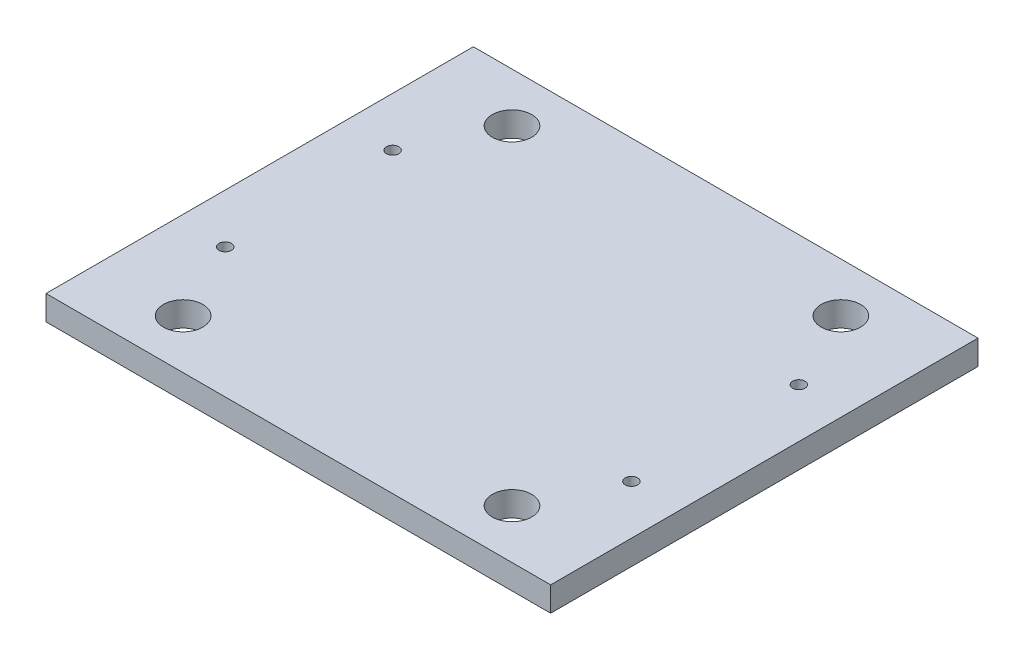
ISO-10303-21;
HEADER;
FILE_DESCRIPTION(('STEP AP214'),'2;1');
FILE_NAME('part.step','',(''),(''),'','','');
FILE_SCHEMA(('AUTOMOTIVE_DESIGN { 1 0 10303 214 1 1 1 1 }'));
ENDSEC;
DATA;
#1=APPLICATION_CONTEXT('core data for automotive mechanical design processes');
#2=APPLICATION_PROTOCOL_DEFINITION('international standard','automotive_design',2000,#1);
#3=PRODUCT_CONTEXT('',#1,'mechanical');
#4=PRODUCT('Part','Part','',(#3));
#5=PRODUCT_RELATED_PRODUCT_CATEGORY('part','',(#4));
#6=PRODUCT_DEFINITION_FORMATION('','',#4);
#7=PRODUCT_DEFINITION_CONTEXT('part definition',#1,'design');
#8=PRODUCT_DEFINITION('design','',#6,#7);
#9=PRODUCT_DEFINITION_SHAPE('','',#8);
#10=(LENGTH_UNIT() NAMED_UNIT(*) SI_UNIT(.MILLI.,.METRE.));
#11=(NAMED_UNIT(*) PLANE_ANGLE_UNIT() SI_UNIT($,.RADIAN.));
#12=(NAMED_UNIT(*) SI_UNIT($,.STERADIAN.) SOLID_ANGLE_UNIT());
#13=UNCERTAINTY_MEASURE_WITH_UNIT(LENGTH_MEASURE(1.E-05),#10,'distance_accuracy_value','');
#14=(GEOMETRIC_REPRESENTATION_CONTEXT(3) GLOBAL_UNCERTAINTY_ASSIGNED_CONTEXT((#13)) GLOBAL_UNIT_ASSIGNED_CONTEXT((#10,
#11,#12)) REPRESENTATION_CONTEXT('',''));
#15=CARTESIAN_POINT('',(0.,0.,0.));
#16=DIRECTION('',(0.,0.,1.));
#17=DIRECTION('',(1.,0.,0.));
#18=AXIS2_PLACEMENT_3D('',#15,#16,#17);
#19=CARTESIAN_POINT('',(0.,6.35,0.));
#20=DIRECTION('',(0.,-1.,0.));
#21=DIRECTION('',(0.,0.,-1.));
#22=AXIS2_PLACEMENT_3D('',#19,#20,#21);
#23=PLANE('',#22);
#24=DIRECTION('',(0.,0.,-1.));
#25=VECTOR('',#24,1.);
#26=CARTESIAN_POINT('',(65.0875,6.35,55.118));
#27=LINE('',#26,#25);
#28=CARTESIAN_POINT('',(65.0875,6.35,55.118));
#29=VERTEX_POINT('',#28);
#30=CARTESIAN_POINT('',(65.0875,6.35,-55.118));
#31=VERTEX_POINT('',#30);
#32=EDGE_CURVE('E89',#29,#31,#27,.T.);
#33=ORIENTED_EDGE('',*,*,#32,.T.);
#34=DIRECTION('',(-1.,0.,0.));
#35=VECTOR('',#34,1.);
#36=CARTESIAN_POINT('',(-65.0875,6.35,-55.118));
#37=LINE('',#36,#35);
#38=CARTESIAN_POINT('',(-65.0875,6.35,-55.118));
#39=VERTEX_POINT('',#38);
#40=EDGE_CURVE('E84',#31,#39,#37,.T.);
#41=ORIENTED_EDGE('',*,*,#40,.T.);
#42=DIRECTION('',(0.,0.,1.));
#43=VECTOR('',#42,1.);
#44=CARTESIAN_POINT('',(-65.0875,6.35,55.118));
#45=LINE('',#44,#43);
#46=CARTESIAN_POINT('',(-65.0875,6.35,55.118));
#47=VERTEX_POINT('',#46);
#48=EDGE_CURVE('E87',#39,#47,#45,.T.);
#49=ORIENTED_EDGE('',*,*,#48,.T.);
#50=DIRECTION('',(1.,0.,0.));
#51=VECTOR('',#50,1.);
#52=CARTESIAN_POINT('',(-65.0875,6.35,55.118));
#53=LINE('',#52,#51);
#54=EDGE_CURVE('E54',#47,#29,#53,.T.);
#55=ORIENTED_EDGE('',*,*,#54,.T.);
#56=EDGE_LOOP('',(#33,#41,#49,#55));
#57=FACE_BOUND('',#56,.T.);
#58=CARTESIAN_POINT('',(-52.3875,6.35,-21.59));
#59=DIRECTION('',(0.,1.,0.));
#60=DIRECTION('',(0.,0.,1.));
#61=AXIS2_PLACEMENT_3D('',#58,#59,#60);
#62=CIRCLE('',#61,1.5875);
#63=CARTESIAN_POINT('',(-52.3875,6.35,-20.0025));
#64=VERTEX_POINT('',#63);
#65=EDGE_CURVE('E104',#64,#64,#62,.T.);
#66=ORIENTED_EDGE('',*,*,#65,.F.);
#67=EDGE_LOOP('',(#66));
#68=FACE_BOUND('',#67,.T.);
#69=CARTESIAN_POINT('',(52.3875,6.35,-21.59));
#70=DIRECTION('',(0.,1.,0.));
#71=DIRECTION('',(0.,0.,1.));
#72=AXIS2_PLACEMENT_3D('',#69,#70,#71);
#73=CIRCLE('',#72,1.5875);
#74=CARTESIAN_POINT('',(52.3875,6.35,-20.0025));
#75=VERTEX_POINT('',#74);
#76=EDGE_CURVE('E119',#75,#75,#73,.T.);
#77=ORIENTED_EDGE('',*,*,#76,.F.);
#78=EDGE_LOOP('',(#77));
#79=FACE_BOUND('',#78,.T.);
#80=CARTESIAN_POINT('',(52.3875,6.35,21.59));
#81=DIRECTION('',(0.,1.,0.));
#82=DIRECTION('',(0.,0.,1.));
#83=AXIS2_PLACEMENT_3D('',#80,#81,#82);
#84=CIRCLE('',#83,1.5875);
#85=CARTESIAN_POINT('',(52.3875,6.35,23.1775));
#86=VERTEX_POINT('',#85);
#87=EDGE_CURVE('E125',#86,#86,#84,.T.);
#88=ORIENTED_EDGE('',*,*,#87,.F.);
#89=EDGE_LOOP('',(#88));
#90=FACE_BOUND('',#89,.T.);
#91=CARTESIAN_POINT('',(-52.3875,6.35,21.59));
#92=DIRECTION('',(0.,1.,0.));
#93=DIRECTION('',(0.,0.,1.));
#94=AXIS2_PLACEMENT_3D('',#91,#92,#93);
#95=CIRCLE('',#94,1.5875);
#96=CARTESIAN_POINT('',(-52.3875,6.35,23.1775));
#97=VERTEX_POINT('',#96);
#98=EDGE_CURVE('E131',#97,#97,#95,.T.);
#99=ORIENTED_EDGE('',*,*,#98,.F.);
#100=EDGE_LOOP('',(#99));
#101=FACE_BOUND('',#100,.T.);
#102=CARTESIAN_POINT('',(-42.418,6.35,-42.418));
#103=DIRECTION('',(0.,1.,0.));
#104=DIRECTION('',(0.,0.,1.));
#105=AXIS2_PLACEMENT_3D('',#102,#103,#104);
#106=CIRCLE('',#105,5.08000000000001);
#107=CARTESIAN_POINT('',(-42.418,6.35,-37.338));
#108=VERTEX_POINT('',#107);
#109=EDGE_CURVE('E137',#108,#108,#106,.T.);
#110=ORIENTED_EDGE('',*,*,#109,.F.);
#111=EDGE_LOOP('',(#110));
#112=FACE_BOUND('',#111,.T.);
#113=CARTESIAN_POINT('',(42.418,6.35,-42.418));
#114=DIRECTION('',(0.,1.,0.));
#115=DIRECTION('',(0.,0.,1.));
#116=AXIS2_PLACEMENT_3D('',#113,#114,#115);
#117=CIRCLE('',#116,5.08000000000001);
#118=CARTESIAN_POINT('',(42.418,6.35,-37.338));
#119=VERTEX_POINT('',#118);
#120=EDGE_CURVE('E143',#119,#119,#117,.T.);
#121=ORIENTED_EDGE('',*,*,#120,.F.);
#122=EDGE_LOOP('',(#121));
#123=FACE_BOUND('',#122,.T.);
#124=CARTESIAN_POINT('',(42.418,6.35,42.418));
#125=DIRECTION('',(0.,1.,0.));
#126=DIRECTION('',(0.,0.,1.));
#127=AXIS2_PLACEMENT_3D('',#124,#125,#126);
#128=CIRCLE('',#127,5.08000000000001);
#129=CARTESIAN_POINT('',(42.418,6.35,47.498));
#130=VERTEX_POINT('',#129);
#131=EDGE_CURVE('E149',#130,#130,#128,.T.);
#132=ORIENTED_EDGE('',*,*,#131,.F.);
#133=EDGE_LOOP('',(#132));
#134=FACE_BOUND('',#133,.T.);
#135=CARTESIAN_POINT('',(-42.418,6.35,42.418));
#136=DIRECTION('',(0.,1.,0.));
#137=DIRECTION('',(0.,0.,1.));
#138=AXIS2_PLACEMENT_3D('',#135,#136,#137);
#139=CIRCLE('',#138,5.08000000000001);
#140=CARTESIAN_POINT('',(-42.418,6.35,47.498));
#141=VERTEX_POINT('',#140);
#142=EDGE_CURVE('E155',#141,#141,#139,.T.);
#143=ORIENTED_EDGE('',*,*,#142,.F.);
#144=EDGE_LOOP('',(#143));
#145=FACE_BOUND('',#144,.T.);
#146=ADVANCED_FACE('F37',(#57,#68,#79,#90,#101,#112,#123,#134,#145),#23,.F.);
#147=CARTESIAN_POINT('',(0.,0.,0.));
#148=DIRECTION('',(0.,-1.,0.));
#149=DIRECTION('',(0.,0.,-1.));
#150=AXIS2_PLACEMENT_3D('',#147,#148,#149);
#151=PLANE('',#150);
#152=CARTESIAN_POINT('',(42.418,0.,42.418));
#153=DIRECTION('',(0.,1.,0.));
#154=DIRECTION('',(0.,0.,1.));
#155=AXIS2_PLACEMENT_3D('',#152,#153,#154);
#156=CIRCLE('',#155,5.08000000000001);
#157=CARTESIAN_POINT('',(42.418,0.,47.498));
#158=VERTEX_POINT('',#157);
#159=EDGE_CURVE('E152',#158,#158,#156,.T.);
#160=ORIENTED_EDGE('',*,*,#159,.T.);
#161=EDGE_LOOP('',(#160));
#162=FACE_BOUND('',#161,.T.);
#163=CARTESIAN_POINT('',(-42.418,0.,-42.418));
#164=DIRECTION('',(0.,1.,0.));
#165=DIRECTION('',(0.,0.,1.));
#166=AXIS2_PLACEMENT_3D('',#163,#164,#165);
#167=CIRCLE('',#166,5.08000000000001);
#168=CARTESIAN_POINT('',(-42.418,0.,-37.338));
#169=VERTEX_POINT('',#168);
#170=EDGE_CURVE('E140',#169,#169,#167,.T.);
#171=ORIENTED_EDGE('',*,*,#170,.T.);
#172=EDGE_LOOP('',(#171));
#173=FACE_BOUND('',#172,.T.);
#174=CARTESIAN_POINT('',(52.3875,0.,21.59));
#175=DIRECTION('',(0.,1.,0.));
#176=DIRECTION('',(0.,0.,1.));
#177=AXIS2_PLACEMENT_3D('',#174,#175,#176);
#178=CIRCLE('',#177,1.5875);
#179=CARTESIAN_POINT('',(52.3875,0.,23.1775));
#180=VERTEX_POINT('',#179);
#181=EDGE_CURVE('E128',#180,#180,#178,.T.);
#182=ORIENTED_EDGE('',*,*,#181,.T.);
#183=EDGE_LOOP('',(#182));
#184=FACE_BOUND('',#183,.T.);
#185=CARTESIAN_POINT('',(-52.3875,0.,-21.59));
#186=DIRECTION('',(0.,1.,0.));
#187=DIRECTION('',(0.,0.,1.));
#188=AXIS2_PLACEMENT_3D('',#185,#186,#187);
#189=CIRCLE('',#188,1.5875);
#190=CARTESIAN_POINT('',(-52.3875,0.,-20.0025));
#191=VERTEX_POINT('',#190);
#192=EDGE_CURVE('E116',#191,#191,#189,.T.);
#193=ORIENTED_EDGE('',*,*,#192,.T.);
#194=EDGE_LOOP('',(#193));
#195=FACE_BOUND('',#194,.T.);
#196=DIRECTION('',(0.,0.,-1.));
#197=VECTOR('',#196,1.);
#198=CARTESIAN_POINT('',(65.0875,0.,55.118));
#199=LINE('',#198,#197);
#200=CARTESIAN_POINT('',(65.0875,0.,55.118));
#201=VERTEX_POINT('',#200);
#202=CARTESIAN_POINT('',(65.0875,0.,-55.118));
#203=VERTEX_POINT('',#202);
#204=EDGE_CURVE('E101',#201,#203,#199,.T.);
#205=ORIENTED_EDGE('',*,*,#204,.F.);
#206=DIRECTION('',(1.,0.,0.));
#207=VECTOR('',#206,1.);
#208=CARTESIAN_POINT('',(-65.0875,0.,55.118));
#209=LINE('',#208,#207);
#210=CARTESIAN_POINT('',(-65.0875,0.,55.118));
#211=VERTEX_POINT('',#210);
#212=EDGE_CURVE('E77',#211,#201,#209,.T.);
#213=ORIENTED_EDGE('',*,*,#212,.F.);
#214=DIRECTION('',(0.,0.,1.));
#215=VECTOR('',#214,1.);
#216=CARTESIAN_POINT('',(-65.0875,0.,55.118));
#217=LINE('',#216,#215);
#218=CARTESIAN_POINT('',(-65.0875,0.,-55.118));
#219=VERTEX_POINT('',#218);
#220=EDGE_CURVE('E71',#219,#211,#217,.T.);
#221=ORIENTED_EDGE('',*,*,#220,.F.);
#222=DIRECTION('',(-1.,0.,0.));
#223=VECTOR('',#222,1.);
#224=CARTESIAN_POINT('',(-65.0875,0.,-55.118));
#225=LINE('',#224,#223);
#226=EDGE_CURVE('E93',#203,#219,#225,.T.);
#227=ORIENTED_EDGE('',*,*,#226,.F.);
#228=EDGE_LOOP('',(#205,#213,#221,#227));
#229=FACE_BOUND('',#228,.T.);
#230=CARTESIAN_POINT('',(52.3875,0.,-21.59));
#231=DIRECTION('',(0.,1.,0.));
#232=DIRECTION('',(0.,0.,1.));
#233=AXIS2_PLACEMENT_3D('',#230,#231,#232);
#234=CIRCLE('',#233,1.5875);
#235=CARTESIAN_POINT('',(52.3875,0.,-20.0025));
#236=VERTEX_POINT('',#235);
#237=EDGE_CURVE('E122',#236,#236,#234,.T.);
#238=ORIENTED_EDGE('',*,*,#237,.T.);
#239=EDGE_LOOP('',(#238));
#240=FACE_BOUND('',#239,.T.);
#241=CARTESIAN_POINT('',(-52.3875,0.,21.59));
#242=DIRECTION('',(0.,1.,0.));
#243=DIRECTION('',(0.,0.,1.));
#244=AXIS2_PLACEMENT_3D('',#241,#242,#243);
#245=CIRCLE('',#244,1.5875);
#246=CARTESIAN_POINT('',(-52.3875,0.,23.1775));
#247=VERTEX_POINT('',#246);
#248=EDGE_CURVE('E134',#247,#247,#245,.T.);
#249=ORIENTED_EDGE('',*,*,#248,.T.);
#250=EDGE_LOOP('',(#249));
#251=FACE_BOUND('',#250,.T.);
#252=CARTESIAN_POINT('',(42.418,0.,-42.418));
#253=DIRECTION('',(0.,1.,0.));
#254=DIRECTION('',(0.,0.,1.));
#255=AXIS2_PLACEMENT_3D('',#252,#253,#254);
#256=CIRCLE('',#255,5.08000000000001);
#257=CARTESIAN_POINT('',(42.418,0.,-37.338));
#258=VERTEX_POINT('',#257);
#259=EDGE_CURVE('E146',#258,#258,#256,.T.);
#260=ORIENTED_EDGE('',*,*,#259,.T.);
#261=EDGE_LOOP('',(#260));
#262=FACE_BOUND('',#261,.T.);
#263=CARTESIAN_POINT('',(-42.418,0.,42.418));
#264=DIRECTION('',(0.,1.,0.));
#265=DIRECTION('',(0.,0.,1.));
#266=AXIS2_PLACEMENT_3D('',#263,#264,#265);
#267=CIRCLE('',#266,5.08000000000001);
#268=CARTESIAN_POINT('',(-42.418,0.,47.498));
#269=VERTEX_POINT('',#268);
#270=EDGE_CURVE('E158',#269,#269,#267,.T.);
#271=ORIENTED_EDGE('',*,*,#270,.T.);
#272=EDGE_LOOP('',(#271));
#273=FACE_BOUND('',#272,.T.);
#274=ADVANCED_FACE('F112',(#162,#173,#184,#195,#229,#240,#251,#262,#273),#151,.T.);
#275=CARTESIAN_POINT('',(65.0875,6.35,55.118));
#276=DIRECTION('',(-1.,0.,0.));
#277=DIRECTION('',(0.,0.,1.));
#278=AXIS2_PLACEMENT_3D('',#275,#276,#277);
#279=PLANE('',#278);
#280=ORIENTED_EDGE('',*,*,#204,.T.);
#281=DIRECTION('',(0.,-1.,0.));
#282=VECTOR('',#281,1.);
#283=CARTESIAN_POINT('',(65.0875,6.35,-55.118));
#284=LINE('',#283,#282);
#285=EDGE_CURVE('E11',#31,#203,#284,.T.);
#286=ORIENTED_EDGE('',*,*,#285,.F.);
#287=ORIENTED_EDGE('',*,*,#32,.F.);
#288=DIRECTION('',(0.,-1.,0.));
#289=VECTOR('',#288,1.);
#290=CARTESIAN_POINT('',(65.0875,6.35,55.118));
#291=LINE('',#290,#289);
#292=EDGE_CURVE('E97',#29,#201,#291,.T.);
#293=ORIENTED_EDGE('',*,*,#292,.T.);
#294=EDGE_LOOP('',(#280,#286,#287,#293));
#295=FACE_BOUND('',#294,.T.);
#296=ADVANCED_FACE('F39',(#295),#279,.F.);
#297=CARTESIAN_POINT('',(-65.0875,6.35,-55.118));
#298=DIRECTION('',(0.,0.,1.));
#299=DIRECTION('',(1.,0.,0.));
#300=AXIS2_PLACEMENT_3D('',#297,#298,#299);
#301=PLANE('',#300);
#302=ORIENTED_EDGE('',*,*,#226,.T.);
#303=DIRECTION('',(0.,-1.,0.));
#304=VECTOR('',#303,1.);
#305=CARTESIAN_POINT('',(-65.0875,6.35,-55.118));
#306=LINE('',#305,#304);
#307=EDGE_CURVE('E46',#39,#219,#306,.T.);
#308=ORIENTED_EDGE('',*,*,#307,.F.);
#309=ORIENTED_EDGE('',*,*,#40,.F.);
#310=ORIENTED_EDGE('',*,*,#285,.T.);
#311=EDGE_LOOP('',(#302,#308,#309,#310));
#312=FACE_BOUND('',#311,.T.);
#313=ADVANCED_FACE('F92',(#312),#301,.F.);
#314=CARTESIAN_POINT('',(-65.0875,6.35,55.118));
#315=DIRECTION('',(1.,0.,0.));
#316=DIRECTION('',(0.,0.,-1.));
#317=AXIS2_PLACEMENT_3D('',#314,#315,#316);
#318=PLANE('',#317);
#319=ORIENTED_EDGE('',*,*,#220,.T.);
#320=DIRECTION('',(0.,-1.,0.));
#321=VECTOR('',#320,1.);
#322=CARTESIAN_POINT('',(-65.0875,6.35,55.118));
#323=LINE('',#322,#321);
#324=EDGE_CURVE('E94',#47,#211,#323,.T.);
#325=ORIENTED_EDGE('',*,*,#324,.F.);
#326=ORIENTED_EDGE('',*,*,#48,.F.);
#327=ORIENTED_EDGE('',*,*,#307,.T.);
#328=EDGE_LOOP('',(#319,#325,#326,#327));
#329=FACE_BOUND('',#328,.T.);
#330=ADVANCED_FACE('F95',(#329),#318,.F.);
#331=CARTESIAN_POINT('',(-65.0875,6.35,55.118));
#332=DIRECTION('',(0.,0.,-1.));
#333=DIRECTION('',(-1.,0.,0.));
#334=AXIS2_PLACEMENT_3D('',#331,#332,#333);
#335=PLANE('',#334);
#336=ORIENTED_EDGE('',*,*,#212,.T.);
#337=ORIENTED_EDGE('',*,*,#292,.F.);
#338=ORIENTED_EDGE('',*,*,#54,.F.);
#339=ORIENTED_EDGE('',*,*,#324,.T.);
#340=EDGE_LOOP('',(#336,#337,#338,#339));
#341=FACE_BOUND('',#340,.T.);
#342=ADVANCED_FACE('F109',(#341),#335,.F.);
#343=CARTESIAN_POINT('',(-52.3875,6.35,-21.59));
#344=DIRECTION('',(0.,-1.,0.));
#345=DIRECTION('',(0.,0.,-1.));
#346=AXIS2_PLACEMENT_3D('',#343,#344,#345);
#347=CYLINDRICAL_SURFACE('',#346,1.5875);
#348=ORIENTED_EDGE('',*,*,#65,.T.);
#349=EDGE_LOOP('',(#348));
#350=FACE_BOUND('',#349,.T.);
#351=ORIENTED_EDGE('',*,*,#192,.F.);
#352=EDGE_LOOP('',(#351));
#353=FACE_BOUND('',#352,.T.);
#354=ADVANCED_FACE('F175',(#350,#353),#347,.F.);
#355=CARTESIAN_POINT('',(52.3875,6.35,-21.59));
#356=DIRECTION('',(0.,-1.,0.));
#357=DIRECTION('',(0.,0.,-1.));
#358=AXIS2_PLACEMENT_3D('',#355,#356,#357);
#359=CYLINDRICAL_SURFACE('',#358,1.5875);
#360=ORIENTED_EDGE('',*,*,#76,.T.);
#361=EDGE_LOOP('',(#360));
#362=FACE_BOUND('',#361,.T.);
#363=ORIENTED_EDGE('',*,*,#237,.F.);
#364=EDGE_LOOP('',(#363));
#365=FACE_BOUND('',#364,.T.);
#366=ADVANCED_FACE('F221',(#362,#365),#359,.F.);
#367=CARTESIAN_POINT('',(52.3875,6.35,21.59));
#368=DIRECTION('',(0.,-1.,0.));
#369=DIRECTION('',(0.,0.,-1.));
#370=AXIS2_PLACEMENT_3D('',#367,#368,#369);
#371=CYLINDRICAL_SURFACE('',#370,1.5875);
#372=ORIENTED_EDGE('',*,*,#87,.T.);
#373=EDGE_LOOP('',(#372));
#374=FACE_BOUND('',#373,.T.);
#375=ORIENTED_EDGE('',*,*,#181,.F.);
#376=EDGE_LOOP('',(#375));
#377=FACE_BOUND('',#376,.T.);
#378=ADVANCED_FACE('F229',(#374,#377),#371,.F.);
#379=CARTESIAN_POINT('',(-52.3875,6.35,21.59));
#380=DIRECTION('',(0.,-1.,0.));
#381=DIRECTION('',(0.,0.,-1.));
#382=AXIS2_PLACEMENT_3D('',#379,#380,#381);
#383=CYLINDRICAL_SURFACE('',#382,1.5875);
#384=ORIENTED_EDGE('',*,*,#98,.T.);
#385=EDGE_LOOP('',(#384));
#386=FACE_BOUND('',#385,.T.);
#387=ORIENTED_EDGE('',*,*,#248,.F.);
#388=EDGE_LOOP('',(#387));
#389=FACE_BOUND('',#388,.T.);
#390=ADVANCED_FACE('F237',(#386,#389),#383,.F.);
#391=CARTESIAN_POINT('',(-42.418,6.35,-42.418));
#392=DIRECTION('',(0.,-1.,0.));
#393=DIRECTION('',(0.,0.,-1.));
#394=AXIS2_PLACEMENT_3D('',#391,#392,#393);
#395=CYLINDRICAL_SURFACE('',#394,5.08000000000001);
#396=ORIENTED_EDGE('',*,*,#109,.T.);
#397=EDGE_LOOP('',(#396));
#398=FACE_BOUND('',#397,.T.);
#399=ORIENTED_EDGE('',*,*,#170,.F.);
#400=EDGE_LOOP('',(#399));
#401=FACE_BOUND('',#400,.T.);
#402=ADVANCED_FACE('F246',(#398,#401),#395,.F.);
#403=CARTESIAN_POINT('',(42.418,6.35,-42.418));
#404=DIRECTION('',(0.,-1.,0.));
#405=DIRECTION('',(0.,0.,-1.));
#406=AXIS2_PLACEMENT_3D('',#403,#404,#405);
#407=CYLINDRICAL_SURFACE('',#406,5.08000000000001);
#408=ORIENTED_EDGE('',*,*,#120,.T.);
#409=EDGE_LOOP('',(#408));
#410=FACE_BOUND('',#409,.T.);
#411=ORIENTED_EDGE('',*,*,#259,.F.);
#412=EDGE_LOOP('',(#411));
#413=FACE_BOUND('',#412,.T.);
#414=ADVANCED_FACE('F255',(#410,#413),#407,.F.);
#415=CARTESIAN_POINT('',(42.418,6.35,42.418));
#416=DIRECTION('',(0.,-1.,0.));
#417=DIRECTION('',(0.,0.,-1.));
#418=AXIS2_PLACEMENT_3D('',#415,#416,#417);
#419=CYLINDRICAL_SURFACE('',#418,5.08000000000001);
#420=ORIENTED_EDGE('',*,*,#131,.T.);
#421=EDGE_LOOP('',(#420));
#422=FACE_BOUND('',#421,.T.);
#423=ORIENTED_EDGE('',*,*,#159,.F.);
#424=EDGE_LOOP('',(#423));
#425=FACE_BOUND('',#424,.T.);
#426=ADVANCED_FACE('F264',(#422,#425),#419,.F.);
#427=CARTESIAN_POINT('',(-42.418,6.35,42.418));
#428=DIRECTION('',(0.,-1.,0.));
#429=DIRECTION('',(0.,0.,-1.));
#430=AXIS2_PLACEMENT_3D('',#427,#428,#429);
#431=CYLINDRICAL_SURFACE('',#430,5.08000000000001);
#432=ORIENTED_EDGE('',*,*,#142,.T.);
#433=EDGE_LOOP('',(#432));
#434=FACE_BOUND('',#433,.T.);
#435=ORIENTED_EDGE('',*,*,#270,.F.);
#436=EDGE_LOOP('',(#435));
#437=FACE_BOUND('',#436,.T.);
#438=ADVANCED_FACE('F164',(#434,#437),#431,.F.);
#439=CLOSED_SHELL('',(#146,#274,#296,#313,#330,#342,#354,#366,#378,#390,#402,#414,#426,#438));
#440=MANIFOLD_SOLID_BREP('B2',#439);
#441=ADVANCED_BREP_SHAPE_REPRESENTATION('',(#18,#440),#14);
#442=SHAPE_DEFINITION_REPRESENTATION(#9,#441);
ENDSEC;
END-ISO-10303-21;
